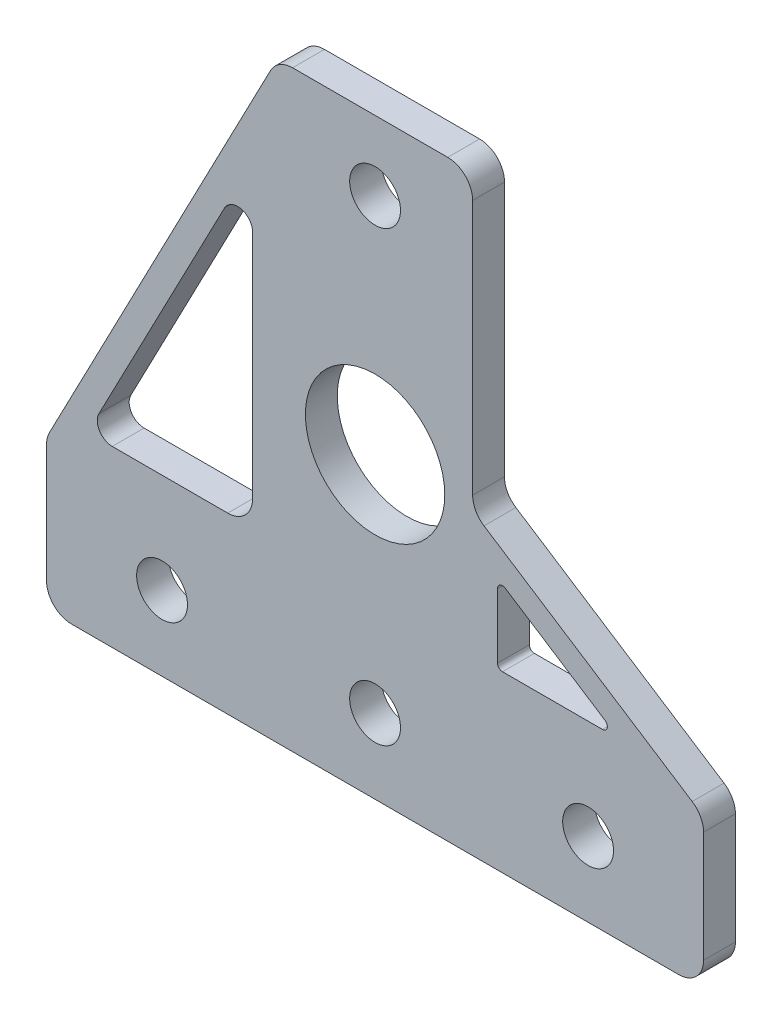
ISO-10303-21;
HEADER;
FILE_DESCRIPTION(('STEP AP214'),'2;1');
FILE_NAME('part.step','',(''),(''),'','','');
FILE_SCHEMA(('AUTOMOTIVE_DESIGN { 1 0 10303 214 1 1 1 1 }'));
ENDSEC;
DATA;
#1=APPLICATION_CONTEXT('core data for automotive mechanical design processes');
#2=APPLICATION_PROTOCOL_DEFINITION('international standard','automotive_design',2000,#1);
#3=PRODUCT_CONTEXT('',#1,'mechanical');
#4=PRODUCT('Part','Part','',(#3));
#5=PRODUCT_RELATED_PRODUCT_CATEGORY('part','',(#4));
#6=PRODUCT_DEFINITION_FORMATION('','',#4);
#7=PRODUCT_DEFINITION_CONTEXT('part definition',#1,'design');
#8=PRODUCT_DEFINITION('design','',#6,#7);
#9=PRODUCT_DEFINITION_SHAPE('','',#8);
#10=(LENGTH_UNIT() NAMED_UNIT(*) SI_UNIT(.MILLI.,.METRE.));
#11=(NAMED_UNIT(*) PLANE_ANGLE_UNIT() SI_UNIT($,.RADIAN.));
#12=(NAMED_UNIT(*) SI_UNIT($,.STERADIAN.) SOLID_ANGLE_UNIT());
#13=UNCERTAINTY_MEASURE_WITH_UNIT(LENGTH_MEASURE(1.E-05),#10,'distance_accuracy_value','');
#14=(GEOMETRIC_REPRESENTATION_CONTEXT(3) GLOBAL_UNCERTAINTY_ASSIGNED_CONTEXT((#13)) GLOBAL_UNIT_ASSIGNED_CONTEXT((#10,
#11,#12)) REPRESENTATION_CONTEXT('',''));
#15=CARTESIAN_POINT('',(0.,0.,0.));
#16=DIRECTION('',(0.,0.,1.));
#17=DIRECTION('',(1.,0.,0.));
#18=AXIS2_PLACEMENT_3D('',#15,#16,#17);
#19=CARTESIAN_POINT('',(9.80000000000001,0.,3.2));
#20=DIRECTION('',(-1.,0.,0.));
#21=DIRECTION('',(0.,0.,1.));
#22=AXIS2_PLACEMENT_3D('',#19,#20,#21);
#23=PLANE('',#22);
#24=DIRECTION('',(0.,1.,0.));
#25=VECTOR('',#24,1.);
#26=CARTESIAN_POINT('',(9.80000000000001,0.,3.2));
#27=LINE('',#26,#25);
#28=CARTESIAN_POINT('',(9.80000000000001,41.3606463991361,3.2));
#29=VERTEX_POINT('',#28);
#30=CARTESIAN_POINT('',(9.80000000000001,67.,3.2));
#31=VERTEX_POINT('',#30);
#32=EDGE_CURVE('E346',#29,#31,#27,.T.);
#33=ORIENTED_EDGE('',*,*,#32,.F.);
#34=DIRECTION('',(0.,0.,1.));
#35=VECTOR('',#34,1.);
#36=CARTESIAN_POINT('',(9.80000000000001,41.3606463991361,0.));
#37=LINE('',#36,#35);
#38=CARTESIAN_POINT('',(9.80000000000001,41.3606463991361,0.));
#39=VERTEX_POINT('',#38);
#40=EDGE_CURVE('E329',#29,#39,#37,.F.);
#41=ORIENTED_EDGE('',*,*,#40,.T.);
#42=DIRECTION('',(0.,1.,0.));
#43=VECTOR('',#42,1.);
#44=CARTESIAN_POINT('',(9.80000000000001,0.,0.));
#45=LINE('',#44,#43);
#46=CARTESIAN_POINT('',(9.80000000000001,67.,0.));
#47=VERTEX_POINT('',#46);
#48=EDGE_CURVE('E368',#39,#47,#45,.T.);
#49=ORIENTED_EDGE('',*,*,#48,.T.);
#50=DIRECTION('',(0.,0.,-1.));
#51=VECTOR('',#50,1.);
#52=CARTESIAN_POINT('',(9.80000000000001,67.,3.2));
#53=LINE('',#52,#51);
#54=EDGE_CURVE('E327',#47,#31,#53,.F.);
#55=ORIENTED_EDGE('',*,*,#54,.T.);
#56=EDGE_LOOP('',(#33,#41,#49,#55));
#57=FACE_BOUND('',#56,.T.);
#58=ADVANCED_FACE('F40',(#57),#23,.F.);
#59=CARTESIAN_POINT('',(0.,10.,3.2));
#60=DIRECTION('',(0.,-1.,0.));
#61=DIRECTION('',(1.,0.,0.));
#62=AXIS2_PLACEMENT_3D('',#59,#60,#61);
#63=PLANE('',#62);
#64=DIRECTION('',(-1.,0.,0.));
#65=VECTOR('',#64,1.);
#66=CARTESIAN_POINT('',(0.,10.,3.2));
#67=LINE('',#66,#65);
#68=CARTESIAN_POINT('',(30.5,10.,3.2));
#69=VERTEX_POINT('',#68);
#70=CARTESIAN_POINT('',(-30.5,10.,3.2));
#71=VERTEX_POINT('',#70);
#72=EDGE_CURVE('E358',#69,#71,#67,.T.);
#73=ORIENTED_EDGE('',*,*,#72,.T.);
#74=DIRECTION('',(0.,0.,1.));
#75=VECTOR('',#74,1.);
#76=CARTESIAN_POINT('',(-30.5,10.,0.));
#77=LINE('',#76,#75);
#78=CARTESIAN_POINT('',(-30.5,10.,0.));
#79=VERTEX_POINT('',#78);
#80=EDGE_CURVE('E55',#71,#79,#77,.F.);
#81=ORIENTED_EDGE('',*,*,#80,.T.);
#82=DIRECTION('',(-1.,0.,0.));
#83=VECTOR('',#82,1.);
#84=CARTESIAN_POINT('',(0.,10.,0.));
#85=LINE('',#84,#83);
#86=CARTESIAN_POINT('',(30.5,10.,0.));
#87=VERTEX_POINT('',#86);
#88=EDGE_CURVE('E436',#87,#79,#85,.T.);
#89=ORIENTED_EDGE('',*,*,#88,.F.);
#90=DIRECTION('',(0.,0.,1.));
#91=VECTOR('',#90,1.);
#92=CARTESIAN_POINT('',(30.5,10.,3.2));
#93=LINE('',#92,#91);
#94=EDGE_CURVE('E336',#87,#69,#93,.T.);
#95=ORIENTED_EDGE('',*,*,#94,.T.);
#96=EDGE_LOOP('',(#73,#81,#89,#95));
#97=FACE_BOUND('',#96,.T.);
#98=ADVANCED_FACE('F502',(#97),#63,.T.);
#99=CARTESIAN_POINT('',(0.,69.5,3.2));
#100=DIRECTION('',(0.,-1.,0.));
#101=DIRECTION('',(0.,0.,-1.));
#102=AXIS2_PLACEMENT_3D('',#99,#100,#101);
#103=PLANE('',#102);
#104=DIRECTION('',(-1.,0.,0.));
#105=VECTOR('',#104,1.);
#106=CARTESIAN_POINT('',(0.,69.5,3.2));
#107=LINE('',#106,#105);
#108=CARTESIAN_POINT('',(7.30000000000001,69.5,3.2));
#109=VERTEX_POINT('',#108);
#110=CARTESIAN_POINT('',(-8.28401351806975,69.5,3.2));
#111=VERTEX_POINT('',#110);
#112=EDGE_CURVE('E357',#109,#111,#107,.T.);
#113=ORIENTED_EDGE('',*,*,#112,.F.);
#114=DIRECTION('',(0.,0.,-1.));
#115=VECTOR('',#114,1.);
#116=CARTESIAN_POINT('',(7.30000000000001,69.5,3.2));
#117=LINE('',#116,#115);
#118=CARTESIAN_POINT('',(7.30000000000001,69.5,0.));
#119=VERTEX_POINT('',#118);
#120=EDGE_CURVE('E333',#109,#119,#117,.T.);
#121=ORIENTED_EDGE('',*,*,#120,.T.);
#122=DIRECTION('',(-1.,0.,0.));
#123=VECTOR('',#122,1.);
#124=CARTESIAN_POINT('',(0.,69.5,0.));
#125=LINE('',#124,#123);
#126=CARTESIAN_POINT('',(-8.28401351806975,69.5,0.));
#127=VERTEX_POINT('',#126);
#128=EDGE_CURVE('E439',#119,#127,#125,.T.);
#129=ORIENTED_EDGE('',*,*,#128,.T.);
#130=DIRECTION('',(0.,0.,-1.));
#131=VECTOR('',#130,1.);
#132=CARTESIAN_POINT('',(-8.28401351806975,69.5,3.2));
#133=LINE('',#132,#131);
#134=EDGE_CURVE('E331',#127,#111,#133,.F.);
#135=ORIENTED_EDGE('',*,*,#134,.T.);
#136=EDGE_LOOP('',(#113,#121,#129,#135));
#137=FACE_BOUND('',#136,.T.);
#138=ADVANCED_FACE('F487',(#137),#103,.F.);
#139=CARTESIAN_POINT('',(0.,40.,3.2));
#140=DIRECTION('',(0.,0.,-1.));
#141=DIRECTION('',(-1.,0.,0.));
#142=AXIS2_PLACEMENT_3D('',#139,#140,#141);
#143=CYLINDRICAL_SURFACE('',#142,7.00000000000001);
#144=CARTESIAN_POINT('',(0.,40.,3.2));
#145=DIRECTION('',(0.,0.,1.));
#146=DIRECTION('',(1.,0.,0.));
#147=AXIS2_PLACEMENT_3D('',#144,#145,#146);
#148=CIRCLE('',#147,7.00000000000001);
#149=CARTESIAN_POINT('',(7.00000000000007,40.,3.2));
#150=VERTEX_POINT('',#149);
#151=EDGE_CURVE('E422',#150,#150,#148,.T.);
#152=ORIENTED_EDGE('',*,*,#151,.T.);
#153=EDGE_LOOP('',(#152));
#154=FACE_BOUND('',#153,.T.);
#155=CARTESIAN_POINT('',(0.,40.,0.));
#156=DIRECTION('',(0.,0.,1.));
#157=DIRECTION('',(1.,0.,0.));
#158=AXIS2_PLACEMENT_3D('',#155,#156,#157);
#159=CIRCLE('',#158,7.00000000000001);
#160=CARTESIAN_POINT('',(7.00000000000007,40.,0.));
#161=VERTEX_POINT('',#160);
#162=EDGE_CURVE('E433',#161,#161,#159,.T.);
#163=ORIENTED_EDGE('',*,*,#162,.F.);
#164=EDGE_LOOP('',(#163));
#165=FACE_BOUND('',#164,.T.);
#166=ADVANCED_FACE('F511',(#154,#165),#143,.F.);
#167=CARTESIAN_POINT('',(0.,62.5,3.2));
#168=DIRECTION('',(0.,0.,-1.));
#169=DIRECTION('',(-1.,0.,0.));
#170=AXIS2_PLACEMENT_3D('',#167,#168,#169);
#171=CYLINDRICAL_SURFACE('',#170,2.55270000000001);
#172=CARTESIAN_POINT('',(0.,62.5,3.2));
#173=DIRECTION('',(0.,0.,1.));
#174=DIRECTION('',(1.,0.,0.));
#175=AXIS2_PLACEMENT_3D('',#172,#173,#174);
#176=CIRCLE('',#175,2.55270000000001);
#177=CARTESIAN_POINT('',(2.5527,62.5,3.2));
#178=VERTEX_POINT('',#177);
#179=EDGE_CURVE('E419',#178,#178,#176,.T.);
#180=ORIENTED_EDGE('',*,*,#179,.T.);
#181=EDGE_LOOP('',(#180));
#182=FACE_BOUND('',#181,.T.);
#183=CARTESIAN_POINT('',(0.,62.5,0.));
#184=DIRECTION('',(0.,0.,1.));
#185=DIRECTION('',(1.,0.,0.));
#186=AXIS2_PLACEMENT_3D('',#183,#184,#185);
#187=CIRCLE('',#186,2.55270000000001);
#188=CARTESIAN_POINT('',(2.5527,62.5,0.));
#189=VERTEX_POINT('',#188);
#190=EDGE_CURVE('E418',#189,#189,#187,.T.);
#191=ORIENTED_EDGE('',*,*,#190,.F.);
#192=EDGE_LOOP('',(#191));
#193=FACE_BOUND('',#192,.T.);
#194=ADVANCED_FACE('F514',(#182,#193),#171,.F.);
#195=CARTESIAN_POINT('',(0.,17.5,3.2));
#196=DIRECTION('',(0.,0.,-1.));
#197=DIRECTION('',(-1.,0.,0.));
#198=AXIS2_PLACEMENT_3D('',#195,#196,#197);
#199=CYLINDRICAL_SURFACE('',#198,2.55270000000001);
#200=CARTESIAN_POINT('',(0.,17.5,3.2));
#201=DIRECTION('',(0.,0.,1.));
#202=DIRECTION('',(1.,0.,0.));
#203=AXIS2_PLACEMENT_3D('',#200,#201,#202);
#204=CIRCLE('',#203,2.55270000000001);
#205=CARTESIAN_POINT('',(2.55269999999999,17.5,3.2));
#206=VERTEX_POINT('',#205);
#207=EDGE_CURVE('E226',#206,#206,#204,.T.);
#208=ORIENTED_EDGE('',*,*,#207,.T.);
#209=EDGE_LOOP('',(#208));
#210=FACE_BOUND('',#209,.T.);
#211=CARTESIAN_POINT('',(0.,17.5,0.));
#212=DIRECTION('',(0.,0.,1.));
#213=DIRECTION('',(1.,0.,0.));
#214=AXIS2_PLACEMENT_3D('',#211,#212,#213);
#215=CIRCLE('',#214,2.55270000000001);
#216=CARTESIAN_POINT('',(2.55269999999999,17.5,0.));
#217=VERTEX_POINT('',#216);
#218=EDGE_CURVE('E423',#217,#217,#215,.T.);
#219=ORIENTED_EDGE('',*,*,#218,.F.);
#220=EDGE_LOOP('',(#219));
#221=FACE_BOUND('',#220,.T.);
#222=ADVANCED_FACE('F518',(#210,#221),#199,.F.);
#223=CARTESIAN_POINT('',(0.,0.,3.2));
#224=DIRECTION('',(0.,0.,1.));
#225=DIRECTION('',(1.,0.,0.));
#226=AXIS2_PLACEMENT_3D('',#223,#224,#225);
#227=PLANE('',#226);
#228=DIRECTION('',(-0.462293587656858,-0.886726924600438,0.));
#229=VECTOR('',#228,1.);
#230=CARTESIAN_POINT('',(-36.1955973619113,18.8705136808167,3.2));
#231=LINE('',#230,#229);
#232=CARTESIAN_POINT('',(-10.5008308295708,68.1557339691421,3.2));
#233=VERTEX_POINT('',#232);
#234=CARTESIAN_POINT('',(-32.7168173115011,25.5431736913018,3.2));
#235=VERTEX_POINT('',#234);
#236=EDGE_CURVE('E470',#233,#235,#231,.T.);
#237=ORIENTED_EDGE('',*,*,#236,.T.);
#238=CARTESIAN_POINT('',(-30.5,24.3874397221596,3.2));
#239=DIRECTION('',(0.,0.,1.));
#240=DIRECTION('',(1.,0.,0.));
#241=AXIS2_PLACEMENT_3D('',#238,#239,#240);
#242=CIRCLE('',#241,2.5);
#243=CARTESIAN_POINT('',(-33.,24.3874397221596,3.2));
#244=VERTEX_POINT('',#243);
#245=EDGE_CURVE('E299',#235,#244,#242,.T.);
#246=ORIENTED_EDGE('',*,*,#245,.T.);
#247=DIRECTION('',(0.,1.,0.));
#248=VECTOR('',#247,1.);
#249=CARTESIAN_POINT('',(-33.,0.,3.2));
#250=LINE('',#249,#248);
#251=CARTESIAN_POINT('',(-33.,12.5,3.2));
#252=VERTEX_POINT('',#251);
#253=EDGE_CURVE('E403',#252,#244,#250,.T.);
#254=ORIENTED_EDGE('',*,*,#253,.F.);
#255=CARTESIAN_POINT('',(-30.5,12.5,3.2));
#256=DIRECTION('',(0.,0.,1.));
#257=DIRECTION('',(1.,0.,0.));
#258=AXIS2_PLACEMENT_3D('',#255,#256,#257);
#259=CIRCLE('',#258,2.5);
#260=EDGE_CURVE('E291',#252,#71,#259,.T.);
#261=ORIENTED_EDGE('',*,*,#260,.T.);
#262=ORIENTED_EDGE('',*,*,#72,.F.);
#263=CARTESIAN_POINT('',(30.5,12.5,3.2));
#264=DIRECTION('',(0.,0.,1.));
#265=DIRECTION('',(1.,0.,0.));
#266=AXIS2_PLACEMENT_3D('',#263,#264,#265);
#267=CIRCLE('',#266,2.5);
#268=CARTESIAN_POINT('',(33.,12.5,3.2));
#269=VERTEX_POINT('',#268);
#270=EDGE_CURVE('E289',#69,#269,#267,.T.);
#271=ORIENTED_EDGE('',*,*,#270,.T.);
#272=DIRECTION('',(0.,1.,0.));
#273=VECTOR('',#272,1.);
#274=CARTESIAN_POINT('',(33.,0.,3.2));
#275=LINE('',#274,#273);
#276=CARTESIAN_POINT('',(33.,23.6393536008638,3.2));
#277=VERTEX_POINT('',#276);
#278=EDGE_CURVE('E408',#269,#277,#275,.T.);
#279=ORIENTED_EDGE('',*,*,#278,.T.);
#280=CARTESIAN_POINT('',(30.5,23.6393536008638,3.2));
#281=DIRECTION('',(0.,0.,1.));
#282=DIRECTION('',(1.,0.,0.));
#283=AXIS2_PLACEMENT_3D('',#280,#281,#282);
#284=CIRCLE('',#283,2.5);
#285=CARTESIAN_POINT('',(31.8573776884065,25.7387644255992,3.2));
#286=VERTEX_POINT('',#285);
#287=EDGE_CURVE('E297',#277,#286,#284,.T.);
#288=ORIENTED_EDGE('',*,*,#287,.T.);
#289=DIRECTION('',(0.839764329894162,-0.542951075362604,0.));
#290=VECTOR('',#289,1.);
#291=CARTESIAN_POINT('',(21.1270373670143,32.6764844609821,3.2));
#292=LINE('',#291,#290);
#293=CARTESIAN_POINT('',(10.9426223115935,39.2612355744007,3.2));
#294=VERTEX_POINT('',#293);
#295=EDGE_CURVE('E349',#294,#286,#292,.T.);
#296=ORIENTED_EDGE('',*,*,#295,.F.);
#297=CARTESIAN_POINT('',(12.3,41.3606463991361,3.2));
#298=DIRECTION('',(0.,0.,1.));
#299=DIRECTION('',(1.,0.,0.));
#300=AXIS2_PLACEMENT_3D('',#297,#298,#299);
#301=CIRCLE('',#300,2.5);
#302=EDGE_CURVE('E48',#294,#29,#301,.F.);
#303=ORIENTED_EDGE('',*,*,#302,.T.);
#304=ORIENTED_EDGE('',*,*,#32,.T.);
#305=CARTESIAN_POINT('',(7.30000000000001,67.,3.2));
#306=DIRECTION('',(0.,0.,1.));
#307=DIRECTION('',(1.,0.,0.));
#308=AXIS2_PLACEMENT_3D('',#305,#306,#307);
#309=CIRCLE('',#308,2.5);
#310=EDGE_CURVE('E295',#31,#109,#309,.T.);
#311=ORIENTED_EDGE('',*,*,#310,.T.);
#312=ORIENTED_EDGE('',*,*,#112,.T.);
#313=CARTESIAN_POINT('',(-8.28401351806975,67.,3.2));
#314=DIRECTION('',(0.,0.,1.));
#315=DIRECTION('',(1.,0.,0.));
#316=AXIS2_PLACEMENT_3D('',#313,#314,#315);
#317=CIRCLE('',#316,2.5);
#318=EDGE_CURVE('E293',#111,#233,#317,.T.);
#319=ORIENTED_EDGE('',*,*,#318,.T.);
#320=EDGE_LOOP('',(#237,#246,#254,#261,#262,#271,#279,#288,#296,#303,#304,#311,#312,#319));
#321=FACE_BOUND('',#320,.T.);
#322=ORIENTED_EDGE('',*,*,#179,.F.);
#323=EDGE_LOOP('',(#322));
#324=FACE_BOUND('',#323,.T.);
#325=ORIENTED_EDGE('',*,*,#151,.F.);
#326=EDGE_LOOP('',(#325));
#327=FACE_BOUND('',#326,.T.);
#328=ORIENTED_EDGE('',*,*,#207,.F.);
#329=EDGE_LOOP('',(#328));
#330=FACE_BOUND('',#329,.T.);
#331=CARTESIAN_POINT('',(21.4,17.5,3.2));
#332=DIRECTION('',(0.,0.,1.));
#333=DIRECTION('',(1.,0.,0.));
#334=AXIS2_PLACEMENT_3D('',#331,#332,#333);
#335=CIRCLE('',#334,2.55270000000001);
#336=CARTESIAN_POINT('',(23.9527,17.5,3.2));
#337=VERTEX_POINT('',#336);
#338=EDGE_CURVE('E412',#337,#337,#335,.T.);
#339=ORIENTED_EDGE('',*,*,#338,.F.);
#340=EDGE_LOOP('',(#339));
#341=FACE_BOUND('',#340,.T.);
#342=CARTESIAN_POINT('',(-21.4,17.5,3.2));
#343=DIRECTION('',(0.,0.,1.));
#344=DIRECTION('',(1.,0.,0.));
#345=AXIS2_PLACEMENT_3D('',#342,#343,#344);
#346=CIRCLE('',#345,2.55270000000001);
#347=CARTESIAN_POINT('',(-18.8473,17.5,3.2));
#348=VERTEX_POINT('',#347);
#349=EDGE_CURVE('E376',#348,#348,#346,.T.);
#350=ORIENTED_EDGE('',*,*,#349,.F.);
#351=EDGE_LOOP('',(#350));
#352=FACE_BOUND('',#351,.T.);
#353=DIRECTION('',(0.,-1.,0.));
#354=VECTOR('',#353,1.);
#355=CARTESIAN_POINT('',(12.3,0.,3.2));
#356=LINE('',#355,#354);
#357=CARTESIAN_POINT('',(12.3,34.487913976209,3.2));
#358=VERTEX_POINT('',#357);
#359=CARTESIAN_POINT('',(12.3,28.,3.2));
#360=VERTEX_POINT('',#359);
#361=EDGE_CURVE('E385',#358,#360,#356,.T.);
#362=ORIENTED_EDGE('',*,*,#361,.F.);
#363=CARTESIAN_POINT('',(12.8,34.487913976209,3.2));
#364=DIRECTION('',(0.,0.,1.));
#365=DIRECTION('',(1.,0.,0.));
#366=AXIS2_PLACEMENT_3D('',#363,#364,#365);
#367=CIRCLE('',#366,0.5);
#368=CARTESIAN_POINT('',(13.0714755376813,34.907796141156,3.2));
#369=VERTEX_POINT('',#368);
#370=EDGE_CURVE('E279',#358,#369,#367,.F.);
#371=ORIENTED_EDGE('',*,*,#370,.T.);
#372=DIRECTION('',(0.839764329894162,-0.542951075362604,0.));
#373=VECTOR('',#372,1.);
#374=CARTESIAN_POINT('',(19.7696596786078,30.5770736362467,3.2));
#375=LINE('',#374,#373);
#376=CARTESIAN_POINT('',(23.1061158208845,28.4198821649471,3.2));
#377=VERTEX_POINT('',#376);
#378=EDGE_CURVE('E388',#369,#377,#375,.T.);
#379=ORIENTED_EDGE('',*,*,#378,.T.);
#380=CARTESIAN_POINT('',(22.8346402832032,28.,3.2));
#381=DIRECTION('',(0.,0.,1.));
#382=DIRECTION('',(1.,0.,0.));
#383=AXIS2_PLACEMENT_3D('',#380,#381,#382);
#384=CIRCLE('',#383,0.5);
#385=CARTESIAN_POINT('',(22.8346402832032,27.5,3.2));
#386=VERTEX_POINT('',#385);
#387=EDGE_CURVE('E275',#377,#386,#384,.F.);
#388=ORIENTED_EDGE('',*,*,#387,.T.);
#389=DIRECTION('',(-1.,0.,0.));
#390=VECTOR('',#389,1.);
#391=CARTESIAN_POINT('',(0.,27.5,3.2));
#392=LINE('',#391,#390);
#393=CARTESIAN_POINT('',(12.8,27.5,3.2));
#394=VERTEX_POINT('',#393);
#395=EDGE_CURVE('E392',#386,#394,#392,.T.);
#396=ORIENTED_EDGE('',*,*,#395,.T.);
#397=CARTESIAN_POINT('',(12.8,28.,3.2));
#398=DIRECTION('',(0.,0.,1.));
#399=DIRECTION('',(1.,0.,0.));
#400=AXIS2_PLACEMENT_3D('',#397,#398,#399);
#401=CIRCLE('',#400,0.5);
#402=EDGE_CURVE('E271',#394,#360,#401,.F.);
#403=ORIENTED_EDGE('',*,*,#402,.T.);
#404=EDGE_LOOP('',(#362,#371,#379,#388,#396,#403));
#405=FACE_BOUND('',#404,.T.);
#406=DIRECTION('',(1.,0.,0.));
#407=VECTOR('',#406,1.);
#408=CARTESIAN_POINT('',(0.,27.5,3.2));
#409=LINE('',#408,#407);
#410=CARTESIAN_POINT('',(-26.4036351120577,27.5,3.2));
#411=VERTEX_POINT('',#410);
#412=CARTESIAN_POINT('',(-14.8,27.5,3.2));
#413=VERTEX_POINT('',#412);
#414=EDGE_CURVE('E462',#411,#413,#409,.T.);
#415=ORIENTED_EDGE('',*,*,#414,.F.);
#416=CARTESIAN_POINT('',(-26.4036351120577,29.,3.2));
#417=DIRECTION('',(0.,0.,1.));
#418=DIRECTION('',(1.,0.,0.));
#419=AXIS2_PLACEMENT_3D('',#416,#417,#418);
#420=CIRCLE('',#419,1.5);
#421=CARTESIAN_POINT('',(-27.7337254989583,29.6934403814853,3.2));
#422=VERTEX_POINT('',#421);
#423=EDGE_CURVE('E243',#411,#422,#420,.F.);
#424=ORIENTED_EDGE('',*,*,#423,.T.);
#425=DIRECTION('',(-0.462293587656858,-0.886726924600438,0.));
#426=VECTOR('',#425,1.);
#427=CARTESIAN_POINT('',(-33.9787800504102,17.7147797116745,3.2));
#428=LINE('',#427,#426);
#429=CARTESIAN_POINT('',(-15.1300903869006,53.8685163507338,3.2));
#430=VERTEX_POINT('',#429);
#431=EDGE_CURVE('E222',#430,#422,#428,.T.);
#432=ORIENTED_EDGE('',*,*,#431,.F.);
#433=CARTESIAN_POINT('',(-13.8,53.1750759692485,3.2));
#434=DIRECTION('',(0.,0.,1.));
#435=DIRECTION('',(1.,0.,0.));
#436=AXIS2_PLACEMENT_3D('',#433,#434,#435);
#437=CIRCLE('',#436,1.5);
#438=CARTESIAN_POINT('',(-12.3,53.1750759692485,3.2));
#439=VERTEX_POINT('',#438);
#440=EDGE_CURVE('E448',#430,#439,#437,.F.);
#441=ORIENTED_EDGE('',*,*,#440,.T.);
#442=DIRECTION('',(0.,1.,0.));
#443=VECTOR('',#442,1.);
#444=CARTESIAN_POINT('',(-12.3,0.,3.2));
#445=LINE('',#444,#443);
#446=CARTESIAN_POINT('',(-12.3,30.,3.2));
#447=VERTEX_POINT('',#446);
#448=EDGE_CURVE('E237',#447,#439,#445,.T.);
#449=ORIENTED_EDGE('',*,*,#448,.F.);
#450=CARTESIAN_POINT('',(-14.8,30.,3.2));
#451=DIRECTION('',(0.,0.,1.));
#452=DIRECTION('',(1.,0.,0.));
#453=AXIS2_PLACEMENT_3D('',#450,#451,#452);
#454=CIRCLE('',#453,2.5);
#455=EDGE_CURVE('E252',#447,#413,#454,.F.);
#456=ORIENTED_EDGE('',*,*,#455,.T.);
#457=EDGE_LOOP('',(#415,#424,#432,#441,#449,#456));
#458=FACE_BOUND('',#457,.T.);
#459=ADVANCED_FACE('F344',(#321,#324,#327,#330,#341,#352,#405,#458),#227,.T.);
#460=CARTESIAN_POINT('',(0.,0.,0.));
#461=DIRECTION('',(0.,0.,1.));
#462=DIRECTION('',(1.,0.,0.));
#463=AXIS2_PLACEMENT_3D('',#460,#461,#462);
#464=PLANE('',#463);
#465=DIRECTION('',(0.,-1.,0.));
#466=VECTOR('',#465,1.);
#467=CARTESIAN_POINT('',(-33.,0.,0.));
#468=LINE('',#467,#466);
#469=CARTESIAN_POINT('',(-33.,24.3874397221596,0.));
#470=VERTEX_POINT('',#469);
#471=CARTESIAN_POINT('',(-33.,12.5,0.));
#472=VERTEX_POINT('',#471);
#473=EDGE_CURVE('E400',#470,#472,#468,.T.);
#474=ORIENTED_EDGE('',*,*,#473,.F.);
#475=CARTESIAN_POINT('',(-30.5,24.3874397221596,0.));
#476=DIRECTION('',(0.,0.,1.));
#477=DIRECTION('',(1.,0.,0.));
#478=AXIS2_PLACEMENT_3D('',#475,#476,#477);
#479=CIRCLE('',#478,2.5);
#480=CARTESIAN_POINT('',(-32.7168173115011,25.5431736913018,0.));
#481=VERTEX_POINT('',#480);
#482=EDGE_CURVE('E315',#470,#481,#479,.F.);
#483=ORIENTED_EDGE('',*,*,#482,.T.);
#484=DIRECTION('',(0.462293587656858,0.886726924600438,0.));
#485=VECTOR('',#484,1.);
#486=CARTESIAN_POINT('',(-36.1955973619113,18.8705136808167,0.));
#487=LINE('',#486,#485);
#488=CARTESIAN_POINT('',(-10.5008308295708,68.1557339691422,0.));
#489=VERTEX_POINT('',#488);
#490=EDGE_CURVE('E389',#481,#489,#487,.T.);
#491=ORIENTED_EDGE('',*,*,#490,.T.);
#492=CARTESIAN_POINT('',(-8.28401351806975,67.,0.));
#493=DIRECTION('',(0.,0.,1.));
#494=DIRECTION('',(1.,0.,0.));
#495=AXIS2_PLACEMENT_3D('',#492,#493,#494);
#496=CIRCLE('',#495,2.5);
#497=EDGE_CURVE('E309',#489,#127,#496,.F.);
#498=ORIENTED_EDGE('',*,*,#497,.T.);
#499=ORIENTED_EDGE('',*,*,#128,.F.);
#500=CARTESIAN_POINT('',(7.30000000000001,67.,0.));
#501=DIRECTION('',(0.,0.,1.));
#502=DIRECTION('',(1.,0.,0.));
#503=AXIS2_PLACEMENT_3D('',#500,#501,#502);
#504=CIRCLE('',#503,2.5);
#505=EDGE_CURVE('E311',#119,#47,#504,.F.);
#506=ORIENTED_EDGE('',*,*,#505,.T.);
#507=ORIENTED_EDGE('',*,*,#48,.F.);
#508=CARTESIAN_POINT('',(12.3,41.3606463991361,0.));
#509=DIRECTION('',(0.,0.,1.));
#510=DIRECTION('',(1.,0.,0.));
#511=AXIS2_PLACEMENT_3D('',#508,#509,#510);
#512=CIRCLE('',#511,2.5);
#513=CARTESIAN_POINT('',(10.9426223115935,39.2612355744007,0.));
#514=VERTEX_POINT('',#513);
#515=EDGE_CURVE('E11',#39,#514,#512,.T.);
#516=ORIENTED_EDGE('',*,*,#515,.T.);
#517=DIRECTION('',(-0.839764329894162,0.542951075362604,0.));
#518=VECTOR('',#517,1.);
#519=CARTESIAN_POINT('',(21.1270373670143,32.6764844609821,0.));
#520=LINE('',#519,#518);
#521=CARTESIAN_POINT('',(31.8573776884065,25.7387644255992,0.));
#522=VERTEX_POINT('',#521);
#523=EDGE_CURVE('E366',#522,#514,#520,.T.);
#524=ORIENTED_EDGE('',*,*,#523,.F.);
#525=CARTESIAN_POINT('',(30.5,23.6393536008638,0.));
#526=DIRECTION('',(0.,0.,1.));
#527=DIRECTION('',(1.,0.,0.));
#528=AXIS2_PLACEMENT_3D('',#525,#526,#527);
#529=CIRCLE('',#528,2.5);
#530=CARTESIAN_POINT('',(33.,23.6393536008638,0.));
#531=VERTEX_POINT('',#530);
#532=EDGE_CURVE('E313',#522,#531,#529,.F.);
#533=ORIENTED_EDGE('',*,*,#532,.T.);
#534=DIRECTION('',(0.,-1.,0.));
#535=VECTOR('',#534,1.);
#536=CARTESIAN_POINT('',(33.,0.,0.));
#537=LINE('',#536,#535);
#538=CARTESIAN_POINT('',(33.,12.5,0.));
#539=VERTEX_POINT('',#538);
#540=EDGE_CURVE('E411',#531,#539,#537,.T.);
#541=ORIENTED_EDGE('',*,*,#540,.T.);
#542=CARTESIAN_POINT('',(30.5,12.5,0.));
#543=DIRECTION('',(0.,0.,1.));
#544=DIRECTION('',(1.,0.,0.));
#545=AXIS2_PLACEMENT_3D('',#542,#543,#544);
#546=CIRCLE('',#545,2.5);
#547=EDGE_CURVE('E62',#539,#87,#546,.F.);
#548=ORIENTED_EDGE('',*,*,#547,.T.);
#549=ORIENTED_EDGE('',*,*,#88,.T.);
#550=CARTESIAN_POINT('',(-30.5,12.5,0.));
#551=DIRECTION('',(0.,0.,1.));
#552=DIRECTION('',(1.,0.,0.));
#553=AXIS2_PLACEMENT_3D('',#550,#551,#552);
#554=CIRCLE('',#553,2.5);
#555=EDGE_CURVE('E307',#79,#472,#554,.F.);
#556=ORIENTED_EDGE('',*,*,#555,.T.);
#557=EDGE_LOOP('',(#474,#483,#491,#498,#499,#506,#507,#516,#524,#533,#541,#548,#549,#556));
#558=FACE_BOUND('',#557,.T.);
#559=ORIENTED_EDGE('',*,*,#190,.T.);
#560=EDGE_LOOP('',(#559));
#561=FACE_BOUND('',#560,.T.);
#562=ORIENTED_EDGE('',*,*,#162,.T.);
#563=EDGE_LOOP('',(#562));
#564=FACE_BOUND('',#563,.T.);
#565=ORIENTED_EDGE('',*,*,#218,.T.);
#566=EDGE_LOOP('',(#565));
#567=FACE_BOUND('',#566,.T.);
#568=CARTESIAN_POINT('',(21.4,17.5,0.));
#569=DIRECTION('',(0.,0.,1.));
#570=DIRECTION('',(1.,0.,0.));
#571=AXIS2_PLACEMENT_3D('',#568,#569,#570);
#572=CIRCLE('',#571,2.55270000000001);
#573=CARTESIAN_POINT('',(23.9527,17.5,0.));
#574=VERTEX_POINT('',#573);
#575=EDGE_CURVE('E399',#574,#574,#572,.F.);
#576=ORIENTED_EDGE('',*,*,#575,.F.);
#577=EDGE_LOOP('',(#576));
#578=FACE_BOUND('',#577,.T.);
#579=CARTESIAN_POINT('',(-21.4,17.5,0.));
#580=DIRECTION('',(0.,0.,1.));
#581=DIRECTION('',(1.,0.,0.));
#582=AXIS2_PLACEMENT_3D('',#579,#580,#581);
#583=CIRCLE('',#582,2.55270000000001);
#584=CARTESIAN_POINT('',(-18.8473,17.5,0.));
#585=VERTEX_POINT('',#584);
#586=EDGE_CURVE('E396',#585,#585,#583,.F.);
#587=ORIENTED_EDGE('',*,*,#586,.F.);
#588=EDGE_LOOP('',(#587));
#589=FACE_BOUND('',#588,.T.);
#590=DIRECTION('',(0.,1.,0.));
#591=VECTOR('',#590,1.);
#592=CARTESIAN_POINT('',(12.3,0.,0.));
#593=LINE('',#592,#591);
#594=CARTESIAN_POINT('',(12.3,28.,0.));
#595=VERTEX_POINT('',#594);
#596=CARTESIAN_POINT('',(12.3,34.487913976209,0.));
#597=VERTEX_POINT('',#596);
#598=EDGE_CURVE('E373',#595,#597,#593,.T.);
#599=ORIENTED_EDGE('',*,*,#598,.F.);
#600=CARTESIAN_POINT('',(12.8,28.,0.));
#601=DIRECTION('',(0.,0.,1.));
#602=DIRECTION('',(1.,0.,0.));
#603=AXIS2_PLACEMENT_3D('',#600,#601,#602);
#604=CIRCLE('',#603,0.5);
#605=CARTESIAN_POINT('',(12.8,27.5,0.));
#606=VERTEX_POINT('',#605);
#607=EDGE_CURVE('E273',#595,#606,#604,.T.);
#608=ORIENTED_EDGE('',*,*,#607,.T.);
#609=DIRECTION('',(1.,0.,0.));
#610=VECTOR('',#609,1.);
#611=CARTESIAN_POINT('',(0.,27.5,0.));
#612=LINE('',#611,#610);
#613=CARTESIAN_POINT('',(22.8346402832032,27.5,0.));
#614=VERTEX_POINT('',#613);
#615=EDGE_CURVE('E379',#606,#614,#612,.T.);
#616=ORIENTED_EDGE('',*,*,#615,.T.);
#617=CARTESIAN_POINT('',(22.8346402832032,28.,0.));
#618=DIRECTION('',(0.,0.,1.));
#619=DIRECTION('',(1.,0.,0.));
#620=AXIS2_PLACEMENT_3D('',#617,#618,#619);
#621=CIRCLE('',#620,0.5);
#622=CARTESIAN_POINT('',(23.1061158208845,28.4198821649471,0.));
#623=VERTEX_POINT('',#622);
#624=EDGE_CURVE('E277',#614,#623,#621,.T.);
#625=ORIENTED_EDGE('',*,*,#624,.T.);
#626=DIRECTION('',(-0.839764329894162,0.542951075362604,0.));
#627=VECTOR('',#626,1.);
#628=CARTESIAN_POINT('',(19.7696596786078,30.5770736362467,0.));
#629=LINE('',#628,#627);
#630=CARTESIAN_POINT('',(13.0714755376813,34.907796141156,0.));
#631=VERTEX_POINT('',#630);
#632=EDGE_CURVE('E372',#623,#631,#629,.T.);
#633=ORIENTED_EDGE('',*,*,#632,.T.);
#634=CARTESIAN_POINT('',(12.8,34.487913976209,0.));
#635=DIRECTION('',(0.,0.,1.));
#636=DIRECTION('',(1.,0.,0.));
#637=AXIS2_PLACEMENT_3D('',#634,#635,#636);
#638=CIRCLE('',#637,0.5);
#639=EDGE_CURVE('E281',#631,#597,#638,.T.);
#640=ORIENTED_EDGE('',*,*,#639,.T.);
#641=EDGE_LOOP('',(#599,#608,#616,#625,#633,#640));
#642=FACE_BOUND('',#641,.T.);
#643=DIRECTION('',(0.,-1.,0.));
#644=VECTOR('',#643,1.);
#645=CARTESIAN_POINT('',(-12.3,0.,0.));
#646=LINE('',#645,#644);
#647=CARTESIAN_POINT('',(-12.3,53.1750759692485,0.));
#648=VERTEX_POINT('',#647);
#649=CARTESIAN_POINT('',(-12.3,30.,0.));
#650=VERTEX_POINT('',#649);
#651=EDGE_CURVE('E459',#648,#650,#646,.T.);
#652=ORIENTED_EDGE('',*,*,#651,.F.);
#653=CARTESIAN_POINT('',(-13.8,53.1750759692485,0.));
#654=DIRECTION('',(0.,0.,1.));
#655=DIRECTION('',(1.,0.,0.));
#656=AXIS2_PLACEMENT_3D('',#653,#654,#655);
#657=CIRCLE('',#656,1.5);
#658=CARTESIAN_POINT('',(-15.1300903869006,53.8685163507338,0.));
#659=VERTEX_POINT('',#658);
#660=EDGE_CURVE('E236',#648,#659,#657,.T.);
#661=ORIENTED_EDGE('',*,*,#660,.T.);
#662=DIRECTION('',(0.462293587656858,0.886726924600438,0.));
#663=VECTOR('',#662,1.);
#664=CARTESIAN_POINT('',(-33.9787800504102,17.7147797116745,0.));
#665=LINE('',#664,#663);
#666=CARTESIAN_POINT('',(-27.7337254989583,29.6934403814853,0.));
#667=VERTEX_POINT('',#666);
#668=EDGE_CURVE('E219',#667,#659,#665,.T.);
#669=ORIENTED_EDGE('',*,*,#668,.F.);
#670=CARTESIAN_POINT('',(-26.4036351120577,29.,0.));
#671=DIRECTION('',(0.,0.,1.));
#672=DIRECTION('',(1.,0.,0.));
#673=AXIS2_PLACEMENT_3D('',#670,#671,#672);
#674=CIRCLE('',#673,1.5);
#675=CARTESIAN_POINT('',(-26.4036351120577,27.5,0.));
#676=VERTEX_POINT('',#675);
#677=EDGE_CURVE('E233',#667,#676,#674,.T.);
#678=ORIENTED_EDGE('',*,*,#677,.T.);
#679=DIRECTION('',(-1.,0.,0.));
#680=VECTOR('',#679,1.);
#681=CARTESIAN_POINT('',(0.,27.5,0.));
#682=LINE('',#681,#680);
#683=CARTESIAN_POINT('',(-14.8,27.5,0.));
#684=VERTEX_POINT('',#683);
#685=EDGE_CURVE('E465',#684,#676,#682,.T.);
#686=ORIENTED_EDGE('',*,*,#685,.F.);
#687=CARTESIAN_POINT('',(-14.8,30.,0.));
#688=DIRECTION('',(0.,0.,1.));
#689=DIRECTION('',(1.,0.,0.));
#690=AXIS2_PLACEMENT_3D('',#687,#688,#689);
#691=CIRCLE('',#690,2.5);
#692=EDGE_CURVE('E254',#684,#650,#691,.T.);
#693=ORIENTED_EDGE('',*,*,#692,.T.);
#694=EDGE_LOOP('',(#652,#661,#669,#678,#686,#693));
#695=FACE_BOUND('',#694,.T.);
#696=ADVANCED_FACE('F231',(#558,#561,#564,#567,#578,#589,#642,#695),#464,.F.);
#697=CARTESIAN_POINT('',(33.,0.,-27.6267985839837));
#698=DIRECTION('',(1.,0.,0.));
#699=DIRECTION('',(0.,0.,-1.));
#700=AXIS2_PLACEMENT_3D('',#697,#698,#699);
#701=PLANE('',#700);
#702=ORIENTED_EDGE('',*,*,#540,.F.);
#703=DIRECTION('',(0.,0.,1.));
#704=VECTOR('',#703,1.);
#705=CARTESIAN_POINT('',(33.,23.6393536008638,3.2));
#706=LINE('',#705,#704);
#707=EDGE_CURVE('E319',#531,#277,#706,.T.);
#708=ORIENTED_EDGE('',*,*,#707,.T.);
#709=ORIENTED_EDGE('',*,*,#278,.F.);
#710=DIRECTION('',(0.,0.,1.));
#711=VECTOR('',#710,1.);
#712=CARTESIAN_POINT('',(33.,12.5,-27.6267985839837));
#713=LINE('',#712,#711);
#714=EDGE_CURVE('E317',#269,#539,#713,.F.);
#715=ORIENTED_EDGE('',*,*,#714,.T.);
#716=EDGE_LOOP('',(#702,#708,#709,#715));
#717=FACE_BOUND('',#716,.T.);
#718=ADVANCED_FACE('F551',(#717),#701,.T.);
#719=CARTESIAN_POINT('',(21.4,17.5,-27.6267985839837));
#720=DIRECTION('',(0.,0.,1.));
#721=DIRECTION('',(1.,0.,0.));
#722=AXIS2_PLACEMENT_3D('',#719,#720,#721);
#723=CYLINDRICAL_SURFACE('',#722,2.55270000000001);
#724=ORIENTED_EDGE('',*,*,#575,.T.);
#725=EDGE_LOOP('',(#724));
#726=FACE_BOUND('',#725,.T.);
#727=ORIENTED_EDGE('',*,*,#338,.T.);
#728=EDGE_LOOP('',(#727));
#729=FACE_BOUND('',#728,.T.);
#730=ADVANCED_FACE('F575',(#726,#729),#723,.F.);
#731=CARTESIAN_POINT('',(-21.4,17.5,-27.6267985839837));
#732=DIRECTION('',(0.,0.,1.));
#733=DIRECTION('',(1.,0.,0.));
#734=AXIS2_PLACEMENT_3D('',#731,#732,#733);
#735=CYLINDRICAL_SURFACE('',#734,2.55270000000001);
#736=ORIENTED_EDGE('',*,*,#586,.T.);
#737=EDGE_LOOP('',(#736));
#738=FACE_BOUND('',#737,.T.);
#739=ORIENTED_EDGE('',*,*,#349,.T.);
#740=EDGE_LOOP('',(#739));
#741=FACE_BOUND('',#740,.T.);
#742=ADVANCED_FACE('F566',(#738,#741),#735,.F.);
#743=CARTESIAN_POINT('',(-33.,0.,-27.6267985839837));
#744=DIRECTION('',(1.,0.,0.));
#745=DIRECTION('',(0.,1.,0.));
#746=AXIS2_PLACEMENT_3D('',#743,#744,#745);
#747=PLANE('',#746);
#748=ORIENTED_EDGE('',*,*,#253,.T.);
#749=DIRECTION('',(0.,0.,1.));
#750=VECTOR('',#749,1.);
#751=CARTESIAN_POINT('',(-33.,24.3874397221596,0.));
#752=LINE('',#751,#750);
#753=EDGE_CURVE('E304',#244,#470,#752,.F.);
#754=ORIENTED_EDGE('',*,*,#753,.T.);
#755=ORIENTED_EDGE('',*,*,#473,.T.);
#756=DIRECTION('',(0.,0.,1.));
#757=VECTOR('',#756,1.);
#758=CARTESIAN_POINT('',(-33.,12.5,3.2));
#759=LINE('',#758,#757);
#760=EDGE_CURVE('E301',#472,#252,#759,.T.);
#761=ORIENTED_EDGE('',*,*,#760,.T.);
#762=EDGE_LOOP('',(#748,#754,#755,#761));
#763=FACE_BOUND('',#762,.T.);
#764=ADVANCED_FACE('F561',(#763),#747,.F.);
#765=CARTESIAN_POINT('',(19.7696596786078,30.5770736362467,-50.1845593783586));
#766=DIRECTION('',(-0.542951075362604,-0.839764329894162,0.));
#767=DIRECTION('',(0.839764329894162,-0.542951075362604,0.));
#768=AXIS2_PLACEMENT_3D('',#765,#766,#767);
#769=PLANE('',#768);
#770=ORIENTED_EDGE('',*,*,#632,.F.);
#771=DIRECTION('',(0.,0.,1.));
#772=VECTOR('',#771,1.);
#773=CARTESIAN_POINT('',(23.1061158208845,28.4198821649471,3.2));
#774=LINE('',#773,#772);
#775=EDGE_CURVE('E268',#623,#377,#774,.T.);
#776=ORIENTED_EDGE('',*,*,#775,.T.);
#777=ORIENTED_EDGE('',*,*,#378,.F.);
#778=DIRECTION('',(0.,0.,1.));
#779=VECTOR('',#778,1.);
#780=CARTESIAN_POINT('',(13.0714755376813,34.907796141156,-50.1845593783586));
#781=LINE('',#780,#779);
#782=EDGE_CURVE('E266',#369,#631,#781,.F.);
#783=ORIENTED_EDGE('',*,*,#782,.T.);
#784=EDGE_LOOP('',(#770,#776,#777,#783));
#785=FACE_BOUND('',#784,.T.);
#786=ADVANCED_FACE('F565',(#785),#769,.T.);
#787=CARTESIAN_POINT('',(0.,27.5,-50.1845593783586));
#788=DIRECTION('',(0.,1.,0.));
#789=DIRECTION('',(-1.,0.,0.));
#790=AXIS2_PLACEMENT_3D('',#787,#788,#789);
#791=PLANE('',#790);
#792=ORIENTED_EDGE('',*,*,#615,.F.);
#793=DIRECTION('',(0.,0.,1.));
#794=VECTOR('',#793,1.);
#795=CARTESIAN_POINT('',(12.8,27.5,-50.1845593783586));
#796=LINE('',#795,#794);
#797=EDGE_CURVE('E258',#606,#394,#796,.T.);
#798=ORIENTED_EDGE('',*,*,#797,.T.);
#799=ORIENTED_EDGE('',*,*,#395,.F.);
#800=DIRECTION('',(0.,0.,1.));
#801=VECTOR('',#800,1.);
#802=CARTESIAN_POINT('',(22.8346402832032,27.5,0.));
#803=LINE('',#802,#801);
#804=EDGE_CURVE('E256',#386,#614,#803,.F.);
#805=ORIENTED_EDGE('',*,*,#804,.T.);
#806=EDGE_LOOP('',(#792,#798,#799,#805));
#807=FACE_BOUND('',#806,.T.);
#808=ADVANCED_FACE('F572',(#807),#791,.T.);
#809=CARTESIAN_POINT('',(12.3,0.,-50.1845593783586));
#810=DIRECTION('',(-1.,0.,0.));
#811=DIRECTION('',(0.,-1.,0.));
#812=AXIS2_PLACEMENT_3D('',#809,#810,#811);
#813=PLANE('',#812);
#814=ORIENTED_EDGE('',*,*,#361,.T.);
#815=DIRECTION('',(0.,0.,1.));
#816=VECTOR('',#815,1.);
#817=CARTESIAN_POINT('',(12.3,28.,-50.1845593783586));
#818=LINE('',#817,#816);
#819=EDGE_CURVE('E264',#360,#595,#818,.F.);
#820=ORIENTED_EDGE('',*,*,#819,.T.);
#821=ORIENTED_EDGE('',*,*,#598,.T.);
#822=DIRECTION('',(0.,0.,1.));
#823=VECTOR('',#822,1.);
#824=CARTESIAN_POINT('',(12.3,34.487913976209,-50.1845593783586));
#825=LINE('',#824,#823);
#826=EDGE_CURVE('E261',#597,#358,#825,.T.);
#827=ORIENTED_EDGE('',*,*,#826,.T.);
#828=EDGE_LOOP('',(#814,#820,#821,#827));
#829=FACE_BOUND('',#828,.T.);
#830=ADVANCED_FACE('F579',(#829),#813,.F.);
#831=CARTESIAN_POINT('',(21.1270373670143,32.6764844609821,-50.1845593783586));
#832=DIRECTION('',(-0.542951075362604,-0.839764329894162,0.));
#833=DIRECTION('',(0.839764329894162,-0.542951075362604,0.));
#834=AXIS2_PLACEMENT_3D('',#831,#832,#833);
#835=PLANE('',#834);
#836=ORIENTED_EDGE('',*,*,#295,.T.);
#837=DIRECTION('',(0.,0.,1.));
#838=VECTOR('',#837,1.);
#839=CARTESIAN_POINT('',(31.8573776884065,25.7387644255992,0.));
#840=LINE('',#839,#838);
#841=EDGE_CURVE('E325',#286,#522,#840,.F.);
#842=ORIENTED_EDGE('',*,*,#841,.T.);
#843=ORIENTED_EDGE('',*,*,#523,.T.);
#844=DIRECTION('',(0.,0.,1.));
#845=VECTOR('',#844,1.);
#846=CARTESIAN_POINT('',(10.9426223115935,39.2612355744007,3.2));
#847=LINE('',#846,#845);
#848=EDGE_CURVE('E322',#514,#294,#847,.T.);
#849=ORIENTED_EDGE('',*,*,#848,.T.);
#850=EDGE_LOOP('',(#836,#842,#843,#849));
#851=FACE_BOUND('',#850,.T.);
#852=ADVANCED_FACE('F370',(#851),#835,.F.);
#853=CARTESIAN_POINT('',(0.,27.5,-50.1845593783586));
#854=DIRECTION('',(0.,-1.,0.));
#855=DIRECTION('',(0.,0.,-1.));
#856=AXIS2_PLACEMENT_3D('',#853,#854,#855);
#857=PLANE('',#856);
#858=ORIENTED_EDGE('',*,*,#414,.T.);
#859=DIRECTION('',(0.,0.,1.));
#860=VECTOR('',#859,1.);
#861=CARTESIAN_POINT('',(-14.8,27.5,0.));
#862=LINE('',#861,#860);
#863=EDGE_CURVE('E246',#413,#684,#862,.F.);
#864=ORIENTED_EDGE('',*,*,#863,.T.);
#865=ORIENTED_EDGE('',*,*,#685,.T.);
#866=DIRECTION('',(0.,0.,1.));
#867=VECTOR('',#866,1.);
#868=CARTESIAN_POINT('',(-26.4036351120577,27.5,3.2));
#869=LINE('',#868,#867);
#870=EDGE_CURVE('E241',#676,#411,#869,.T.);
#871=ORIENTED_EDGE('',*,*,#870,.T.);
#872=EDGE_LOOP('',(#858,#864,#865,#871));
#873=FACE_BOUND('',#872,.T.);
#874=ADVANCED_FACE('F625',(#873),#857,.F.);
#875=CARTESIAN_POINT('',(-12.3,0.,-50.1845593783586));
#876=DIRECTION('',(1.,0.,0.));
#877=DIRECTION('',(0.,0.,-1.));
#878=AXIS2_PLACEMENT_3D('',#875,#876,#877);
#879=PLANE('',#878);
#880=ORIENTED_EDGE('',*,*,#651,.T.);
#881=DIRECTION('',(0.,0.,1.));
#882=VECTOR('',#881,1.);
#883=CARTESIAN_POINT('',(-12.3,30.,3.2));
#884=LINE('',#883,#882);
#885=EDGE_CURVE('E242',#650,#447,#884,.T.);
#886=ORIENTED_EDGE('',*,*,#885,.T.);
#887=ORIENTED_EDGE('',*,*,#448,.T.);
#888=DIRECTION('',(0.,0.,1.));
#889=VECTOR('',#888,1.);
#890=CARTESIAN_POINT('',(-12.3,53.1750759692485,0.));
#891=LINE('',#890,#889);
#892=EDGE_CURVE('E445',#439,#648,#891,.F.);
#893=ORIENTED_EDGE('',*,*,#892,.T.);
#894=EDGE_LOOP('',(#880,#886,#887,#893));
#895=FACE_BOUND('',#894,.T.);
#896=ADVANCED_FACE('F458',(#895),#879,.F.);
#897=CARTESIAN_POINT('',(-33.9787800504102,17.7147797116745,-50.1845593783586));
#898=DIRECTION('',(-0.886726924600438,0.462293587656858,0.));
#899=DIRECTION('',(-0.462293587656858,-0.886726924600438,0.));
#900=AXIS2_PLACEMENT_3D('',#897,#898,#899);
#901=PLANE('',#900);
#902=ORIENTED_EDGE('',*,*,#668,.T.);
#903=DIRECTION('',(0.,0.,1.));
#904=VECTOR('',#903,1.);
#905=CARTESIAN_POINT('',(-15.1300903869006,53.8685163507338,3.19999999999999));
#906=LINE('',#905,#904);
#907=EDGE_CURVE('E225',#659,#430,#906,.T.);
#908=ORIENTED_EDGE('',*,*,#907,.T.);
#909=ORIENTED_EDGE('',*,*,#431,.T.);
#910=DIRECTION('',(0.,0.,1.));
#911=VECTOR('',#910,1.);
#912=CARTESIAN_POINT('',(-27.7337254989583,29.6934403814853,0.));
#913=LINE('',#912,#911);
#914=EDGE_CURVE('E215',#422,#667,#913,.F.);
#915=ORIENTED_EDGE('',*,*,#914,.T.);
#916=EDGE_LOOP('',(#902,#908,#909,#915));
#917=FACE_BOUND('',#916,.T.);
#918=ADVANCED_FACE('F217',(#917),#901,.F.);
#919=CARTESIAN_POINT('',(-36.1955973619113,18.8705136808167,-50.1845593783586));
#920=DIRECTION('',(-0.886726924600438,0.462293587656858,0.));
#921=DIRECTION('',(-0.462293587656858,-0.886726924600438,0.));
#922=AXIS2_PLACEMENT_3D('',#919,#920,#921);
#923=PLANE('',#922);
#924=ORIENTED_EDGE('',*,*,#490,.F.);
#925=DIRECTION('',(0.,0.,1.));
#926=VECTOR('',#925,1.);
#927=CARTESIAN_POINT('',(-32.7168173115011,25.5431736913018,3.2));
#928=LINE('',#927,#926);
#929=EDGE_CURVE('E286',#481,#235,#928,.T.);
#930=ORIENTED_EDGE('',*,*,#929,.T.);
#931=ORIENTED_EDGE('',*,*,#236,.F.);
#932=DIRECTION('',(0.,0.,-1.));
#933=VECTOR('',#932,1.);
#934=CARTESIAN_POINT('',(-10.5008308295708,68.1557339691421,0.));
#935=LINE('',#934,#933);
#936=EDGE_CURVE('E283',#233,#489,#935,.T.);
#937=ORIENTED_EDGE('',*,*,#936,.T.);
#938=EDGE_LOOP('',(#924,#930,#931,#937));
#939=FACE_BOUND('',#938,.T.);
#940=ADVANCED_FACE('F479',(#939),#923,.T.);
#941=CARTESIAN_POINT('',(-13.8,53.1750759692485,-50.1845593783586));
#942=DIRECTION('',(0.,0.,-1.));
#943=DIRECTION('',(-1.,0.,0.));
#944=AXIS2_PLACEMENT_3D('',#941,#942,#943);
#945=CYLINDRICAL_SURFACE('',#944,1.5);
#946=ORIENTED_EDGE('',*,*,#660,.F.);
#947=ORIENTED_EDGE('',*,*,#892,.F.);
#948=ORIENTED_EDGE('',*,*,#440,.F.);
#949=ORIENTED_EDGE('',*,*,#907,.F.);
#950=EDGE_LOOP('',(#946,#947,#948,#949));
#951=FACE_BOUND('',#950,.T.);
#952=ADVANCED_FACE('F455',(#951),#945,.F.);
#953=CARTESIAN_POINT('',(-26.4036351120577,29.,-50.1845593783586));
#954=DIRECTION('',(0.,0.,-1.));
#955=DIRECTION('',(-1.,0.,0.));
#956=AXIS2_PLACEMENT_3D('',#953,#954,#955);
#957=CYLINDRICAL_SURFACE('',#956,1.5);
#958=ORIENTED_EDGE('',*,*,#677,.F.);
#959=ORIENTED_EDGE('',*,*,#914,.F.);
#960=ORIENTED_EDGE('',*,*,#423,.F.);
#961=ORIENTED_EDGE('',*,*,#870,.F.);
#962=EDGE_LOOP('',(#958,#959,#960,#961));
#963=FACE_BOUND('',#962,.T.);
#964=ADVANCED_FACE('F239',(#963),#957,.F.);
#965=CARTESIAN_POINT('',(-14.8,30.,-50.1845593783586));
#966=DIRECTION('',(0.,0.,-1.));
#967=DIRECTION('',(-1.,0.,0.));
#968=AXIS2_PLACEMENT_3D('',#965,#966,#967);
#969=CYLINDRICAL_SURFACE('',#968,2.5);
#970=ORIENTED_EDGE('',*,*,#692,.F.);
#971=ORIENTED_EDGE('',*,*,#863,.F.);
#972=ORIENTED_EDGE('',*,*,#455,.F.);
#973=ORIENTED_EDGE('',*,*,#885,.F.);
#974=EDGE_LOOP('',(#970,#971,#972,#973));
#975=FACE_BOUND('',#974,.T.);
#976=ADVANCED_FACE('F524',(#975),#969,.F.);
#977=CARTESIAN_POINT('',(12.8,28.,-50.1845593783586));
#978=DIRECTION('',(0.,0.,1.));
#979=DIRECTION('',(1.,0.,0.));
#980=AXIS2_PLACEMENT_3D('',#977,#978,#979);
#981=CYLINDRICAL_SURFACE('',#980,0.5);
#982=ORIENTED_EDGE('',*,*,#607,.F.);
#983=ORIENTED_EDGE('',*,*,#819,.F.);
#984=ORIENTED_EDGE('',*,*,#402,.F.);
#985=ORIENTED_EDGE('',*,*,#797,.F.);
#986=EDGE_LOOP('',(#982,#983,#984,#985));
#987=FACE_BOUND('',#986,.T.);
#988=ADVANCED_FACE('F527',(#987),#981,.F.);
#989=CARTESIAN_POINT('',(22.8346402832032,28.,-50.1845593783586));
#990=DIRECTION('',(0.,0.,-1.));
#991=DIRECTION('',(-1.,0.,0.));
#992=AXIS2_PLACEMENT_3D('',#989,#990,#991);
#993=CYLINDRICAL_SURFACE('',#992,0.5);
#994=ORIENTED_EDGE('',*,*,#624,.F.);
#995=ORIENTED_EDGE('',*,*,#804,.F.);
#996=ORIENTED_EDGE('',*,*,#387,.F.);
#997=ORIENTED_EDGE('',*,*,#775,.F.);
#998=EDGE_LOOP('',(#994,#995,#996,#997));
#999=FACE_BOUND('',#998,.T.);
#1000=ADVANCED_FACE('F531',(#999),#993,.F.);
#1001=CARTESIAN_POINT('',(12.8,34.487913976209,-50.1845593783586));
#1002=DIRECTION('',(0.,0.,1.));
#1003=DIRECTION('',(1.,0.,0.));
#1004=AXIS2_PLACEMENT_3D('',#1001,#1002,#1003);
#1005=CYLINDRICAL_SURFACE('',#1004,0.5);
#1006=ORIENTED_EDGE('',*,*,#639,.F.);
#1007=ORIENTED_EDGE('',*,*,#782,.F.);
#1008=ORIENTED_EDGE('',*,*,#370,.F.);
#1009=ORIENTED_EDGE('',*,*,#826,.F.);
#1010=EDGE_LOOP('',(#1006,#1007,#1008,#1009));
#1011=FACE_BOUND('',#1010,.T.);
#1012=ADVANCED_FACE('F535',(#1011),#1005,.F.);
#1013=CARTESIAN_POINT('',(-30.5,24.3874397221596,-50.1845593783586));
#1014=DIRECTION('',(0.,0.,-1.));
#1015=DIRECTION('',(-1.,0.,0.));
#1016=AXIS2_PLACEMENT_3D('',#1013,#1014,#1015);
#1017=CYLINDRICAL_SURFACE('',#1016,2.5);
#1018=ORIENTED_EDGE('',*,*,#482,.F.);
#1019=ORIENTED_EDGE('',*,*,#753,.F.);
#1020=ORIENTED_EDGE('',*,*,#245,.F.);
#1021=ORIENTED_EDGE('',*,*,#929,.F.);
#1022=EDGE_LOOP('',(#1018,#1019,#1020,#1021));
#1023=FACE_BOUND('',#1022,.T.);
#1024=ADVANCED_FACE('F539',(#1023),#1017,.T.);
#1025=CARTESIAN_POINT('',(30.5,23.6393536008638,-27.6267985839837));
#1026=DIRECTION('',(0.,0.,-1.));
#1027=DIRECTION('',(-1.,0.,0.));
#1028=AXIS2_PLACEMENT_3D('',#1025,#1026,#1027);
#1029=CYLINDRICAL_SURFACE('',#1028,2.5);
#1030=ORIENTED_EDGE('',*,*,#532,.F.);
#1031=ORIENTED_EDGE('',*,*,#841,.F.);
#1032=ORIENTED_EDGE('',*,*,#287,.F.);
#1033=ORIENTED_EDGE('',*,*,#707,.F.);
#1034=EDGE_LOOP('',(#1030,#1031,#1032,#1033));
#1035=FACE_BOUND('',#1034,.T.);
#1036=ADVANCED_FACE('F499',(#1035),#1029,.T.);
#1037=CARTESIAN_POINT('',(12.3,41.3606463991361,-50.1845593783586));
#1038=DIRECTION('',(0.,0.,-1.));
#1039=DIRECTION('',(-1.,0.,0.));
#1040=AXIS2_PLACEMENT_3D('',#1037,#1038,#1039);
#1041=CYLINDRICAL_SURFACE('',#1040,2.5);
#1042=ORIENTED_EDGE('',*,*,#515,.F.);
#1043=ORIENTED_EDGE('',*,*,#40,.F.);
#1044=ORIENTED_EDGE('',*,*,#302,.F.);
#1045=ORIENTED_EDGE('',*,*,#848,.F.);
#1046=EDGE_LOOP('',(#1042,#1043,#1044,#1045));
#1047=FACE_BOUND('',#1046,.T.);
#1048=ADVANCED_FACE('F361',(#1047),#1041,.F.);
#1049=CARTESIAN_POINT('',(7.30000000000001,67.,3.2));
#1050=DIRECTION('',(0.,0.,-1.));
#1051=DIRECTION('',(-1.,0.,0.));
#1052=AXIS2_PLACEMENT_3D('',#1049,#1050,#1051);
#1053=CYLINDRICAL_SURFACE('',#1052,2.5);
#1054=ORIENTED_EDGE('',*,*,#310,.F.);
#1055=ORIENTED_EDGE('',*,*,#54,.F.);
#1056=ORIENTED_EDGE('',*,*,#505,.F.);
#1057=ORIENTED_EDGE('',*,*,#120,.F.);
#1058=EDGE_LOOP('',(#1054,#1055,#1056,#1057));
#1059=FACE_BOUND('',#1058,.T.);
#1060=ADVANCED_FACE('F490',(#1059),#1053,.T.);
#1061=CARTESIAN_POINT('',(-8.28401351806975,67.,-50.1845593783586));
#1062=DIRECTION('',(0.,0.,1.));
#1063=DIRECTION('',(1.,0.,0.));
#1064=AXIS2_PLACEMENT_3D('',#1061,#1062,#1063);
#1065=CYLINDRICAL_SURFACE('',#1064,2.5);
#1066=ORIENTED_EDGE('',*,*,#318,.F.);
#1067=ORIENTED_EDGE('',*,*,#134,.F.);
#1068=ORIENTED_EDGE('',*,*,#497,.F.);
#1069=ORIENTED_EDGE('',*,*,#936,.F.);
#1070=EDGE_LOOP('',(#1066,#1067,#1068,#1069));
#1071=FACE_BOUND('',#1070,.T.);
#1072=ADVANCED_FACE('F482',(#1071),#1065,.T.);
#1073=CARTESIAN_POINT('',(-30.5,12.5,-27.6267985839837));
#1074=DIRECTION('',(0.,0.,-1.));
#1075=DIRECTION('',(-1.,0.,0.));
#1076=AXIS2_PLACEMENT_3D('',#1073,#1074,#1075);
#1077=CYLINDRICAL_SURFACE('',#1076,2.5);
#1078=ORIENTED_EDGE('',*,*,#555,.F.);
#1079=ORIENTED_EDGE('',*,*,#80,.F.);
#1080=ORIENTED_EDGE('',*,*,#260,.F.);
#1081=ORIENTED_EDGE('',*,*,#760,.F.);
#1082=EDGE_LOOP('',(#1078,#1079,#1080,#1081));
#1083=FACE_BOUND('',#1082,.T.);
#1084=ADVANCED_FACE('F497',(#1083),#1077,.T.);
#1085=CARTESIAN_POINT('',(30.5,12.5,3.2));
#1086=DIRECTION('',(0.,0.,1.));
#1087=DIRECTION('',(1.,0.,0.));
#1088=AXIS2_PLACEMENT_3D('',#1085,#1086,#1087);
#1089=CYLINDRICAL_SURFACE('',#1088,2.5);
#1090=ORIENTED_EDGE('',*,*,#547,.F.);
#1091=ORIENTED_EDGE('',*,*,#714,.F.);
#1092=ORIENTED_EDGE('',*,*,#270,.F.);
#1093=ORIENTED_EDGE('',*,*,#94,.F.);
#1094=EDGE_LOOP('',(#1090,#1091,#1092,#1093));
#1095=FACE_BOUND('',#1094,.T.);
#1096=ADVANCED_FACE('F42',(#1095),#1089,.T.);
#1097=CLOSED_SHELL('',(#58,#98,#138,#166,#194,#222,#459,#696,#718,#730,#742,#764,#786,#808,#830,
#852,#874,#896,#918,#940,#952,#964,#976,#988,#1000,#1012,#1024,#1036,#1048,#1060,#1072,#1084,#1096));
#1098=MANIFOLD_SOLID_BREP('B2',#1097);
#1099=ADVANCED_BREP_SHAPE_REPRESENTATION('',(#18,#1098),#14);
#1100=SHAPE_DEFINITION_REPRESENTATION(#9,#1099);
ENDSEC;
END-ISO-10303-21;
